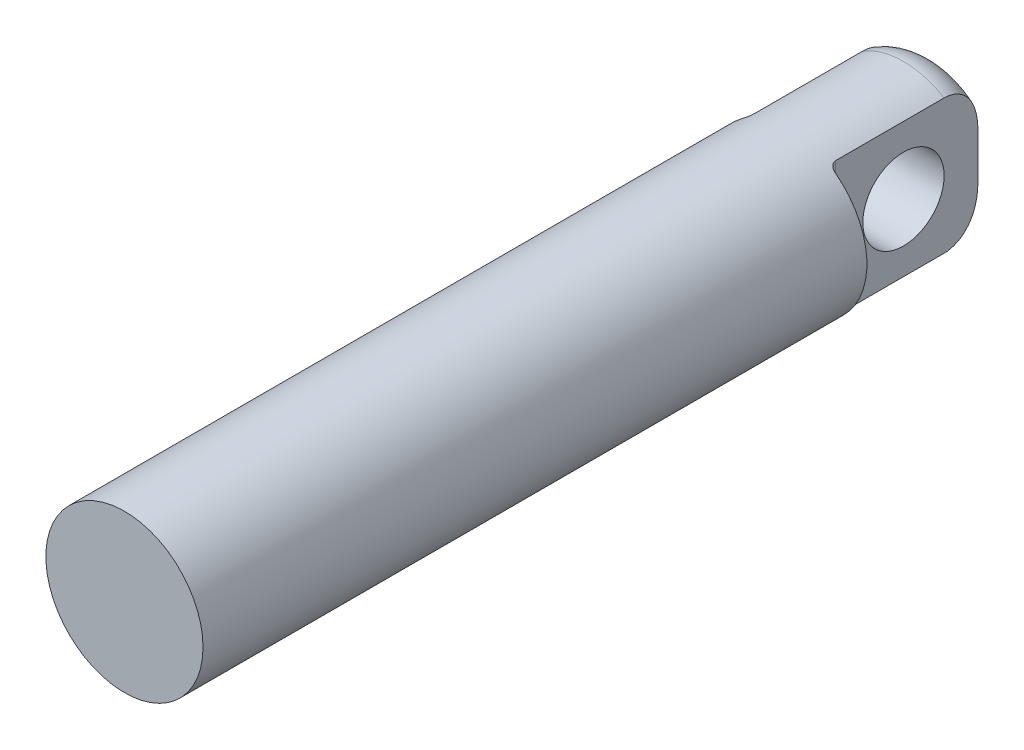
ISO-10303-21;
HEADER;
FILE_DESCRIPTION(('STEP AP214'),'2;1');
FILE_NAME('part.step','',(''),(''),'','','');
FILE_SCHEMA(('AUTOMOTIVE_DESIGN { 1 0 10303 214 1 1 1 1 }'));
ENDSEC;
DATA;
#1=APPLICATION_CONTEXT('core data for automotive mechanical design processes');
#2=APPLICATION_PROTOCOL_DEFINITION('international standard','automotive_design',2000,#1);
#3=PRODUCT_CONTEXT('',#1,'mechanical');
#4=PRODUCT('Part','Part','',(#3));
#5=PRODUCT_RELATED_PRODUCT_CATEGORY('part','',(#4));
#6=PRODUCT_DEFINITION_FORMATION('','',#4);
#7=PRODUCT_DEFINITION_CONTEXT('part definition',#1,'design');
#8=PRODUCT_DEFINITION('design','',#6,#7);
#9=PRODUCT_DEFINITION_SHAPE('','',#8);
#10=(LENGTH_UNIT() NAMED_UNIT(*) SI_UNIT(.MILLI.,.METRE.));
#11=(NAMED_UNIT(*) PLANE_ANGLE_UNIT() SI_UNIT($,.RADIAN.));
#12=(NAMED_UNIT(*) SI_UNIT($,.STERADIAN.) SOLID_ANGLE_UNIT());
#13=UNCERTAINTY_MEASURE_WITH_UNIT(LENGTH_MEASURE(1.E-05),#10,'distance_accuracy_value','');
#14=(GEOMETRIC_REPRESENTATION_CONTEXT(3) GLOBAL_UNCERTAINTY_ASSIGNED_CONTEXT((#13)) GLOBAL_UNIT_ASSIGNED_CONTEXT((#10,
#11,#12)) REPRESENTATION_CONTEXT('',''));
#15=CARTESIAN_POINT('',(0.,0.,0.));
#16=DIRECTION('',(0.,0.,1.));
#17=DIRECTION('',(1.,0.,0.));
#18=AXIS2_PLACEMENT_3D('',#15,#16,#17);
#19=CARTESIAN_POINT('',(0.,0.,30.));
#20=DIRECTION('',(0.,0.,-1.));
#21=DIRECTION('',(-1.,0.,0.));
#22=AXIS2_PLACEMENT_3D('',#19,#20,#21);
#23=CYLINDRICAL_SURFACE('',#22,2.9);
#24=CARTESIAN_POINT('',(0.,0.,30.));
#25=DIRECTION('',(0.,0.,1.));
#26=DIRECTION('',(1.,0.,0.));
#27=AXIS2_PLACEMENT_3D('',#24,#25,#26);
#28=CIRCLE('',#27,2.9);
#29=CARTESIAN_POINT('',(2.9,0.,30.));
#30=VERTEX_POINT('',#29);
#31=EDGE_CURVE('E113',#30,#30,#28,.T.);
#32=ORIENTED_EDGE('',*,*,#31,.F.);
#33=EDGE_LOOP('',(#32));
#34=FACE_BOUND('',#33,.T.);
#35=CARTESIAN_POINT('',(0.,0.,5.5));
#36=DIRECTION('',(0.,0.,-1.));
#37=DIRECTION('',(-1.,0.,0.));
#38=AXIS2_PLACEMENT_3D('',#35,#36,#37);
#39=CIRCLE('',#38,2.9);
#40=CARTESIAN_POINT('',(1.75,2.31246621596944,5.5));
#41=VERTEX_POINT('',#40);
#42=CARTESIAN_POINT('',(1.75,-2.31246621596944,5.5));
#43=VERTEX_POINT('',#42);
#44=EDGE_CURVE('E239',#41,#43,#39,.T.);
#45=ORIENTED_EDGE('',*,*,#44,.F.);
#46=CARTESIAN_POINT('',(1.75,2.31246621596944,5.5));
#47=CARTESIAN_POINT('',(1.73313921470541,2.32524055889306,5.50000341098165));
#48=CARTESIAN_POINT('',(1.71607022742685,2.33785338841019,5.4982909499457));
#49=CARTESIAN_POINT('',(1.68208132439417,2.36241956640179,5.49122605977776));
#50=CARTESIAN_POINT('',(1.66516268969891,2.37436903769734,5.48585426080245));
#51=CARTESIAN_POINT('',(1.63587829251879,2.39460838385724,5.47287367324038));
#52=CARTESIAN_POINT('',(1.62333368997062,2.40312283856084,5.4660232313789));
#53=CARTESIAN_POINT('',(1.59923400258333,2.41922694888727,5.44994709972022));
#54=CARTESIAN_POINT('',(1.58767703736003,2.42681837409441,5.44072606394));
#55=CARTESIAN_POINT('',(1.56593686701006,2.44090382051107,5.41985220619525));
#56=CARTESIAN_POINT('',(1.55576677239381,2.44738749799721,5.40817851679674));
#57=CARTESIAN_POINT('',(1.53751738346671,2.45889348987346,5.38265171328397));
#58=CARTESIAN_POINT('',(1.52943735527775,2.46391631728428,5.36879936690903));
#59=CARTESIAN_POINT('',(1.51695870203811,2.47161529593997,5.34155511957368));
#60=CARTESIAN_POINT('',(1.51219244698324,2.47452858008934,5.3283978388845));
#61=CARTESIAN_POINT('',(1.50491323022598,2.47896244536885,5.30126741972472));
#62=CARTESIAN_POINT('',(1.50239401761498,2.48048689027979,5.28729666044256));
#63=CARTESIAN_POINT('',(1.50071906556918,2.48150000795737,5.26934421841221));
#64=CARTESIAN_POINT('',(1.50044940739404,2.48166306467582,5.26547921550247));
#65=CARTESIAN_POINT('',(1.50009017596073,2.48188024721897,5.25774345658714));
#66=CARTESIAN_POINT('',(1.50000033998766,2.48193453195644,5.25387271725448));
#67=CARTESIAN_POINT('',(1.5,2.48193472919818,5.25));
#68=B_SPLINE_CURVE_WITH_KNOTS('',3,(#46,#47,#48,#49,#50,#51,#52,#53,#54,#55,#56,#57,#58,#59,#60,
#61,#62,#63,#64,#65,#66,#67),.UNSPECIFIED.,.F.,.F.,(4,2,2,2,2,2,2,2,2,2,4),(0.,
0.0635030442776773,0.127344865969353,0.17705539220423,0.226669060839112,0.276723305236884,
0.326759950323056,0.369400190624353,0.411921439355796,0.423551224588689,0.435164006612447),.UNSPECIFIED.);
#69=CARTESIAN_POINT('',(1.5,2.48193472919817,5.25));
#70=VERTEX_POINT('',#69);
#71=EDGE_CURVE('E186',#41,#70,#68,.T.);
#72=ORIENTED_EDGE('',*,*,#71,.T.);
#73=DIRECTION('',(0.,0.,-1.));
#74=VECTOR('',#73,1.);
#75=CARTESIAN_POINT('',(1.5,2.48193472919817,5.5));
#76=LINE('',#75,#74);
#77=CARTESIAN_POINT('',(1.5,2.48193472919817,1.25));
#78=VERTEX_POINT('',#77);
#79=EDGE_CURVE('E114',#70,#78,#76,.T.);
#80=ORIENTED_EDGE('',*,*,#79,.T.);
#81=CARTESIAN_POINT('',(0.,0.,1.25));
#82=DIRECTION('',(0.,0.,1.));
#83=DIRECTION('',(1.,0.,0.));
#84=AXIS2_PLACEMENT_3D('',#81,#82,#83);
#85=CIRCLE('',#84,2.9);
#86=CARTESIAN_POINT('',(-1.5,2.48193472919817,1.25));
#87=VERTEX_POINT('',#86);
#88=EDGE_CURVE('E129',#78,#87,#85,.T.);
#89=ORIENTED_EDGE('',*,*,#88,.T.);
#90=DIRECTION('',(0.,0.,-1.));
#91=VECTOR('',#90,1.);
#92=CARTESIAN_POINT('',(-1.5,2.48193472919817,5.5));
#93=LINE('',#92,#91);
#94=CARTESIAN_POINT('',(-1.5,2.48193472919817,5.25));
#95=VERTEX_POINT('',#94);
#96=EDGE_CURVE('E247',#95,#87,#93,.T.);
#97=ORIENTED_EDGE('',*,*,#96,.F.);
#98=CARTESIAN_POINT('',(-1.5,2.48193472919817,5.25));
#99=CARTESIAN_POINT('',(-1.4999830923949,2.48194218624965,5.26254538251407));
#100=CARTESIAN_POINT('',(-1.50094314088181,2.48136472813251,5.27507760510349));
#101=CARTESIAN_POINT('',(-1.50468216881813,2.47910061981494,5.29971335435492));
#102=CARTESIAN_POINT('',(-1.50745359531137,2.47741857530326,5.31181844211042));
#103=CARTESIAN_POINT('',(-1.51467979083496,2.4730066385631,5.33529885262431));
#104=CARTESIAN_POINT('',(-1.51913334735557,2.47027750107583,5.34667469414407));
#105=CARTESIAN_POINT('',(-1.52951065238162,2.46386576489261,5.36844797105812));
#106=CARTESIAN_POINT('',(-1.53543546243815,2.46018247766735,5.378844692486));
#107=CARTESIAN_POINT('',(-1.54882049074418,2.45177897587739,5.39892716542881));
#108=CARTESIAN_POINT('',(-1.55634009557316,2.44701794302071,5.4085559975275));
#109=CARTESIAN_POINT('',(-1.57243622277483,2.43670591790872,5.42639620543836));
#110=CARTESIAN_POINT('',(-1.58101305350247,2.43115469510988,5.43460716602369));
#111=CARTESIAN_POINT('',(-1.60015626874127,2.41860444434715,5.45055439198826));
#112=CARTESIAN_POINT('',(-1.6108353638371,2.41151107390771,5.45808062544038));
#113=CARTESIAN_POINT('',(-1.63287078835579,2.39664557899193,5.47123681425006));
#114=CARTESIAN_POINT('',(-1.64422772459939,2.38887284335014,5.47686503955978));
#115=CARTESIAN_POINT('',(-1.66928039376351,2.37144957112219,5.48705867337221));
#116=CARTESIAN_POINT('',(-1.68304738110406,2.36170350191461,5.49128443719256));
#117=CARTESIAN_POINT('',(-1.71073231561804,2.34172709403708,5.49730255336155));
#118=CARTESIAN_POINT('',(-1.72465008719293,2.33149727995889,5.49909748189288));
#119=CARTESIAN_POINT('',(-1.74233793386278,2.31824978202953,5.49991212160879));
#120=CARTESIAN_POINT('',(-1.746173325981,2.31536229543662,5.4999999857943));
#121=CARTESIAN_POINT('',(-1.75,2.31246621596943,5.5));
#122=B_SPLINE_CURVE_WITH_KNOTS('',3,(#98,#99,#100,#101,#102,#103,#104,#105,#106,#107,#108,#109,
#110,#111,#112,#113,#114,#115,#116,#117,#118,#119,#120,#121),.UNSPECIFIED.,.F.,.F.,(4,2,2,2,2,2,
2,2,2,2,2,4),(0.,0.0375655820826139,0.0749755166653502,0.112358536793959,0.149768608604606,
0.188948840351175,0.228140526728873,0.272569038016322,0.317037937431791,0.369011291413418,
0.420929521171161,0.435330422023741),.UNSPECIFIED.);
#123=CARTESIAN_POINT('',(-1.75,2.31246621596943,5.5));
#124=VERTEX_POINT('',#123);
#125=EDGE_CURVE('E11',#95,#124,#122,.T.);
#126=ORIENTED_EDGE('',*,*,#125,.T.);
#127=CARTESIAN_POINT('',(0.,0.,5.5));
#128=DIRECTION('',(0.,0.,-1.));
#129=DIRECTION('',(-1.,0.,0.));
#130=AXIS2_PLACEMENT_3D('',#127,#128,#129);
#131=CIRCLE('',#130,2.9);
#132=CARTESIAN_POINT('',(-1.75,-2.31246621596943,5.5));
#133=VERTEX_POINT('',#132);
#134=EDGE_CURVE('E244',#133,#124,#131,.T.);
#135=ORIENTED_EDGE('',*,*,#134,.F.);
#136=CARTESIAN_POINT('',(-1.75,-2.31246621596943,5.5));
#137=CARTESIAN_POINT('',(-1.73313921470541,-2.32524055889306,5.50000341098165));
#138=CARTESIAN_POINT('',(-1.71607022742685,-2.33785338841019,5.4982909499457));
#139=CARTESIAN_POINT('',(-1.68208132439417,-2.36241956640179,5.49122605977776));
#140=CARTESIAN_POINT('',(-1.66516268969891,-2.37436903769734,5.48585426080245));
#141=CARTESIAN_POINT('',(-1.63587829251879,-2.39460838385724,5.47287367324038));
#142=CARTESIAN_POINT('',(-1.62333368997062,-2.40312283856084,5.4660232313789));
#143=CARTESIAN_POINT('',(-1.59923400258333,-2.41922694888727,5.44994709972022));
#144=CARTESIAN_POINT('',(-1.58767703736003,-2.42681837409441,5.44072606394));
#145=CARTESIAN_POINT('',(-1.56593686701006,-2.44090382051107,5.41985220619525));
#146=CARTESIAN_POINT('',(-1.55576677239381,-2.44738749799721,5.40817851679674));
#147=CARTESIAN_POINT('',(-1.53751738346671,-2.45889348987346,5.38265171328397));
#148=CARTESIAN_POINT('',(-1.52943735527775,-2.46391631728428,5.36879936690903));
#149=CARTESIAN_POINT('',(-1.51695870203811,-2.47161529593997,5.34155511957367));
#150=CARTESIAN_POINT('',(-1.51219244698324,-2.47452858008934,5.32839783888449));
#151=CARTESIAN_POINT('',(-1.50491323022598,-2.47896244536885,5.30126741972472));
#152=CARTESIAN_POINT('',(-1.50239401761498,-2.48048689027979,5.28729666044256));
#153=CARTESIAN_POINT('',(-1.50071906556918,-2.48150000795737,5.26934421841221));
#154=CARTESIAN_POINT('',(-1.50044940739404,-2.48166306467582,5.26547921550247));
#155=CARTESIAN_POINT('',(-1.50009017596073,-2.48188024721897,5.25774345658714));
#156=CARTESIAN_POINT('',(-1.50000033998766,-2.48193453195644,5.25387271725448));
#157=CARTESIAN_POINT('',(-1.5,-2.48193472919818,5.25));
#158=B_SPLINE_CURVE_WITH_KNOTS('',3,(#136,#137,#138,#139,#140,#141,#142,#143,#144,#145,#146,
#147,#148,#149,#150,#151,#152,#153,#154,#155,#156,#157),.UNSPECIFIED.,.F.,.F.,(4,2,2,2,2,2,2,2,
2,2,4),(0.,0.0635030442776773,0.127344865969353,0.17705539220423,0.226669060839112,
0.276723305236885,0.326759950323057,0.369400190624354,0.411921439355797,0.423551224588689,
0.435164006612447),.UNSPECIFIED.);
#159=CARTESIAN_POINT('',(-1.5,-2.48193472919817,5.25));
#160=VERTEX_POINT('',#159);
#161=EDGE_CURVE('E48',#133,#160,#158,.T.);
#162=ORIENTED_EDGE('',*,*,#161,.T.);
#163=DIRECTION('',(0.,0.,-1.));
#164=VECTOR('',#163,1.);
#165=CARTESIAN_POINT('',(-1.5,-2.48193472919817,5.5));
#166=LINE('',#165,#164);
#167=CARTESIAN_POINT('',(-1.5,-2.48193472919817,1.25));
#168=VERTEX_POINT('',#167);
#169=EDGE_CURVE('E127',#160,#168,#166,.T.);
#170=ORIENTED_EDGE('',*,*,#169,.T.);
#171=CARTESIAN_POINT('',(0.,0.,1.25));
#172=DIRECTION('',(0.,0.,1.));
#173=DIRECTION('',(1.,0.,0.));
#174=AXIS2_PLACEMENT_3D('',#171,#172,#173);
#175=CIRCLE('',#174,2.9);
#176=CARTESIAN_POINT('',(1.5,-2.48193472919817,1.25));
#177=VERTEX_POINT('',#176);
#178=EDGE_CURVE('E121',#168,#177,#175,.T.);
#179=ORIENTED_EDGE('',*,*,#178,.T.);
#180=DIRECTION('',(0.,0.,-1.));
#181=VECTOR('',#180,1.);
#182=CARTESIAN_POINT('',(1.5,-2.48193472919817,5.5));
#183=LINE('',#182,#181);
#184=CARTESIAN_POINT('',(1.5,-2.48193472919817,5.25));
#185=VERTEX_POINT('',#184);
#186=EDGE_CURVE('E103',#185,#177,#183,.T.);
#187=ORIENTED_EDGE('',*,*,#186,.F.);
#188=CARTESIAN_POINT('',(1.5,-2.48193472919817,5.25));
#189=CARTESIAN_POINT('',(1.4999830923949,-2.48194218624965,5.26254538251407));
#190=CARTESIAN_POINT('',(1.50094314088181,-2.48136472813251,5.27507760510349));
#191=CARTESIAN_POINT('',(1.50468216881813,-2.47910061981494,5.29971335435492));
#192=CARTESIAN_POINT('',(1.50745359531137,-2.47741857530326,5.31181844211042));
#193=CARTESIAN_POINT('',(1.51467979083496,-2.4730066385631,5.33529885262431));
#194=CARTESIAN_POINT('',(1.51913334735557,-2.47027750107583,5.34667469414407));
#195=CARTESIAN_POINT('',(1.52951065238162,-2.46386576489261,5.36844797105812));
#196=CARTESIAN_POINT('',(1.53543546243815,-2.46018247766735,5.378844692486));
#197=CARTESIAN_POINT('',(1.54882049074418,-2.45177897587739,5.39892716542881));
#198=CARTESIAN_POINT('',(1.55634009557316,-2.44701794302071,5.4085559975275));
#199=CARTESIAN_POINT('',(1.57243622277483,-2.43670591790872,5.42639620543836));
#200=CARTESIAN_POINT('',(1.58101305350247,-2.43115469510988,5.43460716602369));
#201=CARTESIAN_POINT('',(1.60015626874127,-2.41860444434715,5.45055439198826));
#202=CARTESIAN_POINT('',(1.6108353638371,-2.41151107390771,5.45808062544038));
#203=CARTESIAN_POINT('',(1.63287078835579,-2.39664557899193,5.47123681425006));
#204=CARTESIAN_POINT('',(1.64422772459939,-2.38887284335014,5.47686503955978));
#205=CARTESIAN_POINT('',(1.66928039376351,-2.37144957112219,5.48705867337221));
#206=CARTESIAN_POINT('',(1.68304738110406,-2.36170350191461,5.49128443719256));
#207=CARTESIAN_POINT('',(1.71073231561804,-2.34172709403708,5.49730255336155));
#208=CARTESIAN_POINT('',(1.72465008719293,-2.33149727995889,5.49909748189288));
#209=CARTESIAN_POINT('',(1.74233793386278,-2.31824978202953,5.49991212160879));
#210=CARTESIAN_POINT('',(1.746173325981,-2.31536229543662,5.4999999857943));
#211=CARTESIAN_POINT('',(1.75,-2.31246621596943,5.5));
#212=B_SPLINE_CURVE_WITH_KNOTS('',3,(#188,#189,#190,#191,#192,#193,#194,#195,#196,#197,#198,
#199,#200,#201,#202,#203,#204,#205,#206,#207,#208,#209,#210,#211),.UNSPECIFIED.,.F.,.F.,(4,2,2,
2,2,2,2,2,2,2,2,4),(0.,0.0375655820826139,0.0749755166653501,0.112358536793959,
0.149768608604606,0.188948840351176,0.228140526728873,0.272569038016322,0.31703793743179,
0.369011291413418,0.420929521171161,0.435330422023741),.UNSPECIFIED.);
#213=EDGE_CURVE('E178',#185,#43,#212,.T.);
#214=ORIENTED_EDGE('',*,*,#213,.T.);
#215=EDGE_LOOP('',(#45,#72,#80,#89,#97,#126,#135,#162,#170,#179,#187,#214));
#216=FACE_BOUND('',#215,.T.);
#217=ADVANCED_FACE('F34',(#34,#216),#23,.T.);
#218=CARTESIAN_POINT('',(0.,0.,0.));
#219=DIRECTION('',(0.,0.,1.));
#220=DIRECTION('',(1.,0.,0.));
#221=AXIS2_PLACEMENT_3D('',#218,#219,#220);
#222=PLANE('',#221);
#223=DIRECTION('',(0.,-1.,0.));
#224=VECTOR('',#223,1.);
#225=CARTESIAN_POINT('',(-1.5,0.,0.));
#226=LINE('',#225,#224);
#227=CARTESIAN_POINT('',(-1.5,0.687386354243375,0.));
#228=VERTEX_POINT('',#227);
#229=CARTESIAN_POINT('',(-1.5,-0.687386354243375,0.));
#230=VERTEX_POINT('',#229);
#231=EDGE_CURVE('E237',#228,#230,#226,.T.);
#232=ORIENTED_EDGE('',*,*,#231,.F.);
#233=CARTESIAN_POINT('',(0.,0.,0.));
#234=DIRECTION('',(0.,0.,1.));
#235=DIRECTION('',(1.,0.,0.));
#236=AXIS2_PLACEMENT_3D('',#233,#234,#235);
#237=CIRCLE('',#236,1.65);
#238=CARTESIAN_POINT('',(1.5,0.687386354243376,0.));
#239=VERTEX_POINT('',#238);
#240=EDGE_CURVE('E124',#228,#239,#237,.F.);
#241=ORIENTED_EDGE('',*,*,#240,.T.);
#242=DIRECTION('',(0.,-1.,0.));
#243=VECTOR('',#242,1.);
#244=CARTESIAN_POINT('',(1.5,0.,0.));
#245=LINE('',#244,#243);
#246=CARTESIAN_POINT('',(1.5,-0.687386354243376,0.));
#247=VERTEX_POINT('',#246);
#248=EDGE_CURVE('E241',#239,#247,#245,.T.);
#249=ORIENTED_EDGE('',*,*,#248,.T.);
#250=CARTESIAN_POINT('',(0.,0.,0.));
#251=DIRECTION('',(0.,0.,1.));
#252=DIRECTION('',(1.,0.,0.));
#253=AXIS2_PLACEMENT_3D('',#250,#251,#252);
#254=CIRCLE('',#253,1.65);
#255=EDGE_CURVE('E122',#247,#230,#254,.F.);
#256=ORIENTED_EDGE('',*,*,#255,.T.);
#257=EDGE_LOOP('',(#232,#241,#249,#256));
#258=FACE_BOUND('',#257,.T.);
#259=ADVANCED_FACE('F166',(#258),#222,.F.);
#260=CARTESIAN_POINT('',(0.,0.,30.));
#261=DIRECTION('',(0.,0.,1.));
#262=DIRECTION('',(1.,0.,0.));
#263=AXIS2_PLACEMENT_3D('',#260,#261,#262);
#264=PLANE('',#263);
#265=ORIENTED_EDGE('',*,*,#31,.T.);
#266=EDGE_LOOP('',(#265));
#267=FACE_BOUND('',#266,.T.);
#268=ADVANCED_FACE('F160',(#267),#264,.T.);
#269=CARTESIAN_POINT('',(-1.5,0.,5.5));
#270=DIRECTION('',(1.,0.,0.));
#271=DIRECTION('',(0.,0.,-1.));
#272=AXIS2_PLACEMENT_3D('',#269,#270,#271);
#273=PLANE('',#272);
#274=CARTESIAN_POINT('',(-1.5,0.,2.75));
#275=DIRECTION('',(-1.,0.,0.));
#276=DIRECTION('',(0.,0.,1.));
#277=AXIS2_PLACEMENT_3D('',#274,#275,#276);
#278=CIRCLE('',#277,1.5);
#279=CARTESIAN_POINT('',(-1.5,0.,4.25));
#280=VERTEX_POINT('',#279);
#281=EDGE_CURVE('E235',#280,#280,#278,.T.);
#282=ORIENTED_EDGE('',*,*,#281,.F.);
#283=EDGE_LOOP('',(#282));
#284=FACE_BOUND('',#283,.T.);
#285=ORIENTED_EDGE('',*,*,#169,.F.);
#286=DIRECTION('',(0.,-1.,0.));
#287=VECTOR('',#286,1.);
#288=CARTESIAN_POINT('',(-1.5,0.,5.25));
#289=LINE('',#288,#287);
#290=EDGE_CURVE('E61',#160,#95,#289,.F.);
#291=ORIENTED_EDGE('',*,*,#290,.T.);
#292=ORIENTED_EDGE('',*,*,#96,.T.);
#293=CARTESIAN_POINT('',(-1.5,2.48193472919817,1.25));
#294=CARTESIAN_POINT('',(-1.5,2.48193587878713,1.21899037749523));
#295=CARTESIAN_POINT('',(-1.5,2.48058546144987,1.18799649683462));
#296=CARTESIAN_POINT('',(-1.5,2.47520767956725,1.12624862747464));
#297=CARTESIAN_POINT('',(-1.5,2.47118090567849,1.09549458735865));
#298=CARTESIAN_POINT('',(-1.5,2.4551677117929,1.00413118595887));
#299=CARTESIAN_POINT('',(-1.5,2.43924792344133,0.944166468616388));
#300=CARTESIAN_POINT('',(-1.5,2.3975825116776,0.827829609213328));
#301=CARTESIAN_POINT('',(-1.5,2.37184011267397,0.771456295303634));
#302=CARTESIAN_POINT('',(-1.5,2.31154950867032,0.663626029225852));
#303=CARTESIAN_POINT('',(-1.5,2.2769981240233,0.612170861527169));
#304=CARTESIAN_POINT('',(-1.5,2.19907204081606,0.51361881740114));
#305=CARTESIAN_POINT('',(-1.5,2.15543983363316,0.466726533395819));
#306=CARTESIAN_POINT('',(-1.5,2.06164337053128,0.380025774230255));
#307=CARTESIAN_POINT('',(-1.5,2.01147616534085,0.34022051678782));
#308=CARTESIAN_POINT('',(-1.5,1.90002808369129,0.263781186786222));
#309=CARTESIAN_POINT('',(-1.5,1.83813293645637,0.228047326596913));
#310=CARTESIAN_POINT('',(-1.5,1.7100450951234,0.16552152374956));
#311=CARTESIAN_POINT('',(-1.5,1.6438523243004,0.138729740785791));
#312=CARTESIAN_POINT('',(-1.5,1.51761782850268,0.0963129649526788));
#313=CARTESIAN_POINT('',(-1.5,1.45790460764813,0.0796855063462344));
#314=CARTESIAN_POINT('',(-1.5,1.3372049717061,0.0518792981435819));
#315=CARTESIAN_POINT('',(-1.5,1.27621767938673,0.0407044410120268));
#316=CARTESIAN_POINT('',(-1.5,1.09198448150617,0.0140346391662883));
#317=CARTESIAN_POINT('',(-1.5,0.967754525508538,0.00548103168504038));
#318=CARTESIAN_POINT('',(-1.5,0.81752408194303,0.0012871017110512));
#319=CARTESIAN_POINT('',(-1.5,0.791444781443436,0.000783532626834251));
#320=CARTESIAN_POINT('',(-1.5,0.739375181717737,0.000141378122333467));
#321=CARTESIAN_POINT('',(-1.5,0.713384899363517,1.48789433914812E-06));
#322=CARTESIAN_POINT('',(-1.5,0.687386354243375,0.));
#323=B_SPLINE_CURVE_WITH_KNOTS('',3,(#293,#294,#295,#296,#297,#298,#299,#300,#301,#302,#303,
#304,#305,#306,#307,#308,#309,#310,#311,#312,#313,#314,#315,#316,#317,#318,#319,#320,#321,#322),
.UNSPECIFIED.,.F.,.F.,(4,2,2,2,2,2,2,2,2,2,2,2,2,2,4),(0.,0.0929685984225542,0.185916686016665,
0.371060860519513,0.55614431108517,0.741294663256296,0.93266755976756,1.12412712482902,
1.33774557454092,1.55136783900606,1.73703697590508,1.92283846376093,2.2953309099718,
2.37359022120399,2.45156836355677),.UNSPECIFIED.);
#324=EDGE_CURVE('E146',#87,#228,#323,.T.);
#325=ORIENTED_EDGE('',*,*,#324,.T.);
#326=ORIENTED_EDGE('',*,*,#231,.T.);
#327=CARTESIAN_POINT('',(-1.5,-0.687386354243375,0.));
#328=CARTESIAN_POINT('',(-1.5,-0.756055618008979,-7.63245487736229E-06));
#329=CARTESIAN_POINT('',(-1.5,-0.824799892836536,0.000979493934290079));
#330=CARTESIAN_POINT('',(-1.5,-0.962482304356395,0.0064076739419813));
#331=CARTESIAN_POINT('',(-1.5,-1.03141970421742,0.0108658852238553));
#332=CARTESIAN_POINT('',(-1.5,-1.16987209248462,0.024833600528609));
#333=CARTESIAN_POINT('',(-1.5,-1.23938026902537,0.0344177545134302));
#334=CARTESIAN_POINT('',(-1.5,-1.37708159654047,0.0600335372862323));
#335=CARTESIAN_POINT('',(-1.5,-1.44527723116788,0.0760514022028623));
#336=CARTESIAN_POINT('',(-1.5,-1.58718936402471,0.117969010555965));
#337=CARTESIAN_POINT('',(-1.5,-1.66064244966042,0.144791146454875));
#338=CARTESIAN_POINT('',(-1.5,-1.80255865208971,0.208875866179287));
#339=CARTESIAN_POINT('',(-1.5,-1.87104142903169,0.246094131879293));
#340=CARTESIAN_POINT('',(-1.5,-2.00157520846748,0.331877757378412));
#341=CARTESIAN_POINT('',(-1.5,-2.06355534774286,0.380552454562518));
#342=CARTESIAN_POINT('',(-1.5,-2.17751074371937,0.48865644520867));
#343=CARTESIAN_POINT('',(-1.5,-2.22947964553742,0.548092523600443));
#344=CARTESIAN_POINT('',(-1.5,-2.31660255069676,0.670660662670845));
#345=CARTESIAN_POINT('',(-1.5,-2.3528168511579,0.733037787957573));
#346=CARTESIAN_POINT('',(-1.5,-2.41256479294192,0.863552678567823));
#347=CARTESIAN_POINT('',(-1.5,-2.43612045855838,0.931680198388377));
#348=CARTESIAN_POINT('',(-1.5,-2.46239705901308,1.04209750540747));
#349=CARTESIAN_POINT('',(-1.5,-2.46970886703455,1.08334405369081));
#350=CARTESIAN_POINT('',(-1.5,-2.4794805654434,1.16638388577682));
#351=CARTESIAN_POINT('',(-1.5,-2.48194315542302,1.20817685233155));
#352=CARTESIAN_POINT('',(-1.5,-2.48193472919817,1.25));
#353=B_SPLINE_CURVE_WITH_KNOTS('',3,(#327,#328,#329,#330,#331,#332,#333,#334,#335,#336,#337,
#338,#339,#340,#341,#342,#343,#344,#345,#346,#347,#348,#349,#350,#351,#352),.UNSPECIFIED.,.F.,
.F.,(4,2,2,2,2,2,2,2,2,2,2,2,4),(0.,0.206116914929546,0.413259190136951,0.623503699329016,
0.833300800291206,1.06715059412201,1.3000183262149,1.5352056940476,1.77054186452314,
1.98568156661219,2.20044573310232,2.32585505986076,2.45119455064447),.UNSPECIFIED.);
#354=EDGE_CURVE('E132',#230,#168,#353,.T.);
#355=ORIENTED_EDGE('',*,*,#354,.T.);
#356=EDGE_LOOP('',(#285,#291,#292,#325,#326,#355));
#357=FACE_BOUND('',#356,.T.);
#358=ADVANCED_FACE('F154',(#284,#357),#273,.F.);
#359=CARTESIAN_POINT('',(0.,0.,5.5));
#360=DIRECTION('',(0.,0.,-1.));
#361=DIRECTION('',(-1.,0.,0.));
#362=AXIS2_PLACEMENT_3D('',#359,#360,#361);
#363=PLANE('',#362);
#364=ORIENTED_EDGE('',*,*,#134,.T.);
#365=DIRECTION('',(0.,-1.,0.));
#366=VECTOR('',#365,1.);
#367=CARTESIAN_POINT('',(-1.75,0.,5.5));
#368=LINE('',#367,#366);
#369=EDGE_CURVE('E197',#124,#133,#368,.T.);
#370=ORIENTED_EDGE('',*,*,#369,.T.);
#371=EDGE_LOOP('',(#364,#370));
#372=FACE_BOUND('',#371,.T.);
#373=ADVANCED_FACE('F159',(#372),#363,.T.);
#374=CARTESIAN_POINT('',(1.5,0.,5.5));
#375=DIRECTION('',(1.,0.,0.));
#376=DIRECTION('',(0.,0.,-1.));
#377=AXIS2_PLACEMENT_3D('',#374,#375,#376);
#378=PLANE('',#377);
#379=CARTESIAN_POINT('',(1.5,0.,2.75));
#380=DIRECTION('',(1.,0.,0.));
#381=DIRECTION('',(0.,0.,-1.));
#382=AXIS2_PLACEMENT_3D('',#379,#380,#381);
#383=CIRCLE('',#382,1.5);
#384=CARTESIAN_POINT('',(1.5,0.,1.25));
#385=VERTEX_POINT('',#384);
#386=EDGE_CURVE('E137',#385,#385,#383,.T.);
#387=ORIENTED_EDGE('',*,*,#386,.F.);
#388=EDGE_LOOP('',(#387));
#389=FACE_BOUND('',#388,.T.);
#390=ORIENTED_EDGE('',*,*,#79,.F.);
#391=DIRECTION('',(0.,-1.,0.));
#392=VECTOR('',#391,1.);
#393=CARTESIAN_POINT('',(1.5,-2.48193472919817,5.25));
#394=LINE('',#393,#392);
#395=EDGE_CURVE('E111',#70,#185,#394,.T.);
#396=ORIENTED_EDGE('',*,*,#395,.T.);
#397=ORIENTED_EDGE('',*,*,#186,.T.);
#398=CARTESIAN_POINT('',(1.5,-2.48193472919817,1.25));
#399=CARTESIAN_POINT('',(1.5,-2.48193587878713,1.21899037749523));
#400=CARTESIAN_POINT('',(1.5,-2.48058546144987,1.18799649683462));
#401=CARTESIAN_POINT('',(1.5,-2.47520767956725,1.12624862747464));
#402=CARTESIAN_POINT('',(1.5,-2.47118090567849,1.09549458735865));
#403=CARTESIAN_POINT('',(1.5,-2.4551677117929,1.00413118595887));
#404=CARTESIAN_POINT('',(1.5,-2.43924792344133,0.944166468616388));
#405=CARTESIAN_POINT('',(1.5,-2.3975825116776,0.827829609213328));
#406=CARTESIAN_POINT('',(1.5,-2.37184011267397,0.771456295303633));
#407=CARTESIAN_POINT('',(1.5,-2.31154950867032,0.663626029225852));
#408=CARTESIAN_POINT('',(1.5,-2.2769981240233,0.612170861527169));
#409=CARTESIAN_POINT('',(1.5,-2.19907204081606,0.513618817401139));
#410=CARTESIAN_POINT('',(1.5,-2.15543983363316,0.466726533395819));
#411=CARTESIAN_POINT('',(1.5,-2.06164337053128,0.380025774230255));
#412=CARTESIAN_POINT('',(1.5,-2.01147616534085,0.34022051678782));
#413=CARTESIAN_POINT('',(1.5,-1.90002808369129,0.263781186786222));
#414=CARTESIAN_POINT('',(1.5,-1.83813293645637,0.228047326596913));
#415=CARTESIAN_POINT('',(1.5,-1.7100450951234,0.165521523749561));
#416=CARTESIAN_POINT('',(1.5,-1.6438523243004,0.138729740785791));
#417=CARTESIAN_POINT('',(1.5,-1.51761782850268,0.0963129649526787));
#418=CARTESIAN_POINT('',(1.5,-1.45790460764813,0.0796855063462345));
#419=CARTESIAN_POINT('',(1.5,-1.3372049717061,0.0518792981435822));
#420=CARTESIAN_POINT('',(1.5,-1.27621767938673,0.040704441012027));
#421=CARTESIAN_POINT('',(1.5,-1.09198448150617,0.0140346391662884));
#422=CARTESIAN_POINT('',(1.5,-0.967754525508538,0.00548103168504034));
#423=CARTESIAN_POINT('',(1.5,-0.817524081943031,0.00128710171105115));
#424=CARTESIAN_POINT('',(1.5,-0.791444781443436,0.000783532626834209));
#425=CARTESIAN_POINT('',(1.5,-0.739375181717737,0.000141378122333437));
#426=CARTESIAN_POINT('',(1.5,-0.713384899363517,1.48789433912325E-06));
#427=CARTESIAN_POINT('',(1.5,-0.687386354243375,0.));
#428=B_SPLINE_CURVE_WITH_KNOTS('',3,(#398,#399,#400,#401,#402,#403,#404,#405,#406,#407,#408,
#409,#410,#411,#412,#413,#414,#415,#416,#417,#418,#419,#420,#421,#422,#423,#424,#425,#426,#427),
.UNSPECIFIED.,.F.,.F.,(4,2,2,2,2,2,2,2,2,2,2,2,2,2,4),(0.,0.0929685984225541,0.185916686016665,
0.371060860519513,0.55614431108517,0.741294663256296,0.93266755976756,1.12412712482902,
1.33774557454092,1.55136783900606,1.73703697590508,1.92283846376093,2.2953309099718,
2.37359022120399,2.45156836355677),.UNSPECIFIED.);
#429=EDGE_CURVE('E108',#177,#247,#428,.T.);
#430=ORIENTED_EDGE('',*,*,#429,.T.);
#431=ORIENTED_EDGE('',*,*,#248,.F.);
#432=CARTESIAN_POINT('',(1.5,0.687386354243376,0.));
#433=CARTESIAN_POINT('',(1.5,0.75605561800898,-7.63245487719067E-06));
#434=CARTESIAN_POINT('',(1.5,0.824799892836537,0.000979493934290311));
#435=CARTESIAN_POINT('',(1.5,0.962482304356395,0.00640767394198153));
#436=CARTESIAN_POINT('',(1.5,1.03141970421743,0.0108658852238555));
#437=CARTESIAN_POINT('',(1.5,1.16987209248462,0.024833600528609));
#438=CARTESIAN_POINT('',(1.5,1.23938026902537,0.0344177545134301));
#439=CARTESIAN_POINT('',(1.5,1.37708159654047,0.0600335372862323));
#440=CARTESIAN_POINT('',(1.5,1.44527723116788,0.0760514022028625));
#441=CARTESIAN_POINT('',(1.5,1.58718936402471,0.117969010555966));
#442=CARTESIAN_POINT('',(1.5,1.66064244966042,0.144791146454875));
#443=CARTESIAN_POINT('',(1.5,1.80255865208971,0.208875866179287));
#444=CARTESIAN_POINT('',(1.5,1.87104142903169,0.246094131879293));
#445=CARTESIAN_POINT('',(1.5,2.00157520846748,0.331877757378412));
#446=CARTESIAN_POINT('',(1.5,2.06355534774286,0.380552454562519));
#447=CARTESIAN_POINT('',(1.5,2.17751074371937,0.488656445208671));
#448=CARTESIAN_POINT('',(1.5,2.22947964553742,0.548092523600443));
#449=CARTESIAN_POINT('',(1.5,2.31660255069676,0.670660662670845));
#450=CARTESIAN_POINT('',(1.5,2.3528168511579,0.733037787957574));
#451=CARTESIAN_POINT('',(1.5,2.41256479294192,0.863552678567824));
#452=CARTESIAN_POINT('',(1.5,2.43612045855838,0.931680198388377));
#453=CARTESIAN_POINT('',(1.5,2.46239705901308,1.04209750540747));
#454=CARTESIAN_POINT('',(1.5,2.46970886703455,1.08334405369081));
#455=CARTESIAN_POINT('',(1.5,2.4794805654434,1.16638388577682));
#456=CARTESIAN_POINT('',(1.5,2.48194315542302,1.20817685233155));
#457=CARTESIAN_POINT('',(1.5,2.48193472919817,1.25));
#458=B_SPLINE_CURVE_WITH_KNOTS('',3,(#432,#433,#434,#435,#436,#437,#438,#439,#440,#441,#442,
#443,#444,#445,#446,#447,#448,#449,#450,#451,#452,#453,#454,#455,#456,#457),.UNSPECIFIED.,.F.,
.F.,(4,2,2,2,2,2,2,2,2,2,2,2,4),(0.,0.206116914929546,0.413259190136951,0.623503699329016,
0.833300800291206,1.06715059412201,1.3000183262149,1.5352056940476,1.77054186452314,
1.98568156661219,2.20044573310232,2.32585505986076,2.45119455064447),.UNSPECIFIED.);
#459=EDGE_CURVE('E123',#239,#78,#458,.T.);
#460=ORIENTED_EDGE('',*,*,#459,.T.);
#461=EDGE_LOOP('',(#390,#396,#397,#430,#431,#460));
#462=FACE_BOUND('',#461,.T.);
#463=ADVANCED_FACE('F106',(#389,#462),#378,.T.);
#464=CARTESIAN_POINT('',(0.,0.,5.5));
#465=DIRECTION('',(0.,0.,-1.));
#466=DIRECTION('',(-1.,0.,0.));
#467=AXIS2_PLACEMENT_3D('',#464,#465,#466);
#468=PLANE('',#467);
#469=ORIENTED_EDGE('',*,*,#44,.T.);
#470=DIRECTION('',(0.,-1.,0.));
#471=VECTOR('',#470,1.);
#472=CARTESIAN_POINT('',(1.75,2.48193472919817,5.5));
#473=LINE('',#472,#471);
#474=EDGE_CURVE('E199',#43,#41,#473,.F.);
#475=ORIENTED_EDGE('',*,*,#474,.T.);
#476=EDGE_LOOP('',(#469,#475));
#477=FACE_BOUND('',#476,.T.);
#478=ADVANCED_FACE('F217',(#477),#468,.T.);
#479=CARTESIAN_POINT('',(2.9,0.,2.75));
#480=DIRECTION('',(-1.,0.,0.));
#481=DIRECTION('',(0.,0.,1.));
#482=AXIS2_PLACEMENT_3D('',#479,#480,#481);
#483=CYLINDRICAL_SURFACE('',#482,1.5);
#484=ORIENTED_EDGE('',*,*,#386,.T.);
#485=EDGE_LOOP('',(#484));
#486=FACE_BOUND('',#485,.T.);
#487=ORIENTED_EDGE('',*,*,#281,.T.);
#488=EDGE_LOOP('',(#487));
#489=FACE_BOUND('',#488,.T.);
#490=ADVANCED_FACE('F222',(#486,#489),#483,.F.);
#491=CARTESIAN_POINT('',(0.,0.,1.25));
#492=DIRECTION('',(0.,0.,1.));
#493=DIRECTION('',(1.,0.,0.));
#494=AXIS2_PLACEMENT_3D('',#491,#492,#493);
#495=TOROIDAL_SURFACE('',#494,1.65,1.25);
#496=ORIENTED_EDGE('',*,*,#459,.F.);
#497=ORIENTED_EDGE('',*,*,#240,.F.);
#498=ORIENTED_EDGE('',*,*,#324,.F.);
#499=ORIENTED_EDGE('',*,*,#88,.F.);
#500=EDGE_LOOP('',(#496,#497,#498,#499));
#501=FACE_BOUND('',#500,.T.);
#502=ADVANCED_FACE('F173',(#501),#495,.T.);
#503=CARTESIAN_POINT('',(0.,0.,1.25));
#504=DIRECTION('',(0.,0.,1.));
#505=DIRECTION('',(1.,0.,0.));
#506=AXIS2_PLACEMENT_3D('',#503,#504,#505);
#507=TOROIDAL_SURFACE('',#506,1.65,1.25);
#508=ORIENTED_EDGE('',*,*,#354,.F.);
#509=ORIENTED_EDGE('',*,*,#255,.F.);
#510=ORIENTED_EDGE('',*,*,#429,.F.);
#511=ORIENTED_EDGE('',*,*,#178,.F.);
#512=EDGE_LOOP('',(#508,#509,#510,#511));
#513=FACE_BOUND('',#512,.T.);
#514=ADVANCED_FACE('F120',(#513),#507,.T.);
#515=CARTESIAN_POINT('',(1.75,0.,5.25));
#516=DIRECTION('',(0.,1.,0.));
#517=DIRECTION('',(0.,0.,1.));
#518=AXIS2_PLACEMENT_3D('',#515,#516,#517);
#519=CYLINDRICAL_SURFACE('',#518,0.25);
#520=ORIENTED_EDGE('',*,*,#71,.F.);
#521=ORIENTED_EDGE('',*,*,#474,.F.);
#522=ORIENTED_EDGE('',*,*,#213,.F.);
#523=ORIENTED_EDGE('',*,*,#395,.F.);
#524=EDGE_LOOP('',(#520,#521,#522,#523));
#525=FACE_BOUND('',#524,.T.);
#526=ADVANCED_FACE('F279',(#525),#519,.F.);
#527=CARTESIAN_POINT('',(-1.75,0.,5.25));
#528=DIRECTION('',(0.,-1.,0.));
#529=DIRECTION('',(0.,0.,-1.));
#530=AXIS2_PLACEMENT_3D('',#527,#528,#529);
#531=CYLINDRICAL_SURFACE('',#530,0.25);
#532=ORIENTED_EDGE('',*,*,#125,.F.);
#533=ORIENTED_EDGE('',*,*,#290,.F.);
#534=ORIENTED_EDGE('',*,*,#161,.F.);
#535=ORIENTED_EDGE('',*,*,#369,.F.);
#536=EDGE_LOOP('',(#532,#533,#534,#535));
#537=FACE_BOUND('',#536,.T.);
#538=ADVANCED_FACE('F36',(#537),#531,.F.);
#539=CLOSED_SHELL('',(#217,#259,#268,#358,#373,#463,#478,#490,#502,#514,#526,#538));
#540=MANIFOLD_SOLID_BREP('B2',#539);
#541=ADVANCED_BREP_SHAPE_REPRESENTATION('',(#18,#540),#14);
#542=SHAPE_DEFINITION_REPRESENTATION(#9,#541);
ENDSEC;
END-ISO-10303-21;
